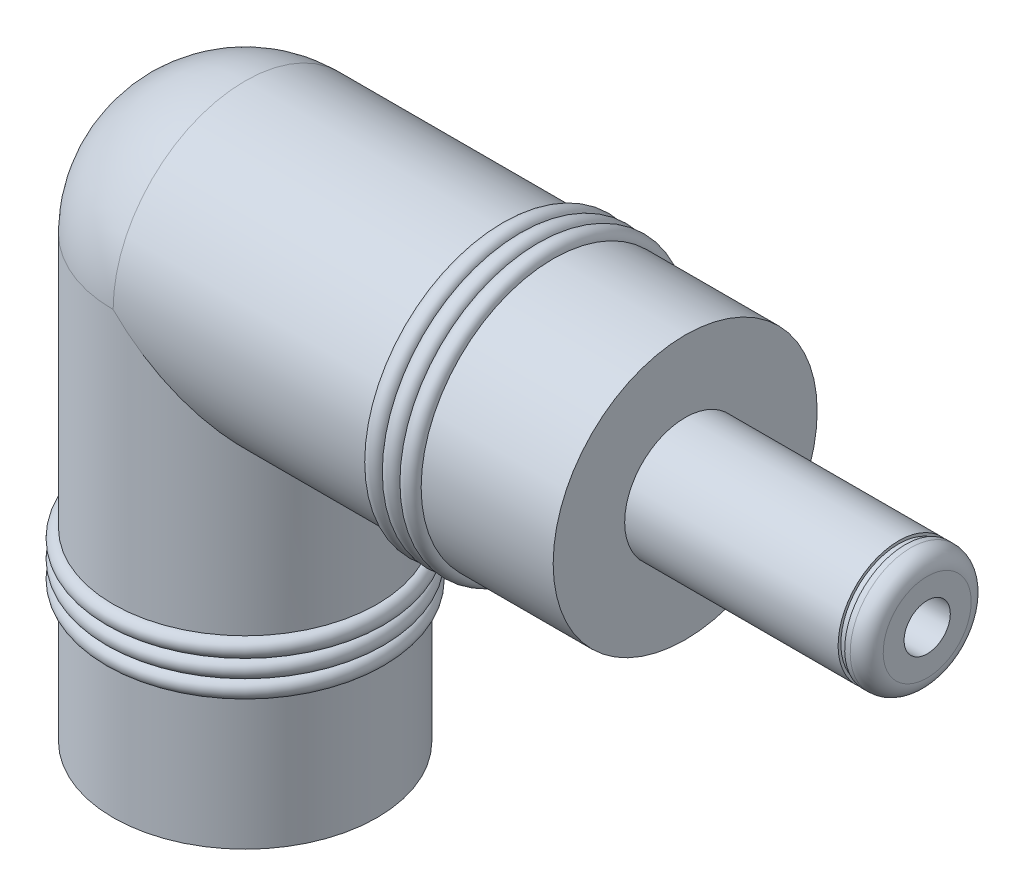
ISO-10303-21;
HEADER;
FILE_DESCRIPTION(('STEP AP214'),'2;1');
FILE_NAME('part.step','',(''),(''),'','','');
FILE_SCHEMA(('AUTOMOTIVE_DESIGN { 1 0 10303 214 1 1 1 1 }'));
ENDSEC;
DATA;
#1=APPLICATION_CONTEXT('core data for automotive mechanical design processes');
#2=APPLICATION_PROTOCOL_DEFINITION('international standard','automotive_design',2000,#1);
#3=PRODUCT_CONTEXT('',#1,'mechanical');
#4=PRODUCT('Part','Part','',(#3));
#5=PRODUCT_RELATED_PRODUCT_CATEGORY('part','',(#4));
#6=PRODUCT_DEFINITION_FORMATION('','',#4);
#7=PRODUCT_DEFINITION_CONTEXT('part definition',#1,'design');
#8=PRODUCT_DEFINITION('design','',#6,#7);
#9=PRODUCT_DEFINITION_SHAPE('','',#8);
#10=(LENGTH_UNIT() NAMED_UNIT(*) SI_UNIT(.MILLI.,.METRE.));
#11=(NAMED_UNIT(*) PLANE_ANGLE_UNIT() SI_UNIT($,.RADIAN.));
#12=(NAMED_UNIT(*) SI_UNIT($,.STERADIAN.) SOLID_ANGLE_UNIT());
#13=UNCERTAINTY_MEASURE_WITH_UNIT(LENGTH_MEASURE(1.E-05),#10,'distance_accuracy_value','');
#14=(GEOMETRIC_REPRESENTATION_CONTEXT(3) GLOBAL_UNCERTAINTY_ASSIGNED_CONTEXT((#13)) GLOBAL_UNIT_ASSIGNED_CONTEXT((#10,
#11,#12)) REPRESENTATION_CONTEXT('',''));
#15=CARTESIAN_POINT('',(0.,0.,0.));
#16=DIRECTION('',(0.,0.,1.));
#17=DIRECTION('',(1.,0.,0.));
#18=AXIS2_PLACEMENT_3D('',#15,#16,#17);
#19=CARTESIAN_POINT('',(0.,-20.,0.));
#20=DIRECTION('',(0.,-1.,0.));
#21=DIRECTION('',(-1.,0.,0.));
#22=AXIS2_PLACEMENT_3D('',#19,#20,#21);
#23=PLANE('',#22);
#24=CARTESIAN_POINT('',(0.,-20.,0.));
#25=DIRECTION('',(0.,-1.,0.));
#26=DIRECTION('',(1.,0.,0.));
#27=AXIS2_PLACEMENT_3D('',#24,#25,#26);
#28=CIRCLE('',#27,6.);
#29=CARTESIAN_POINT('',(6.,-20.,0.));
#30=VERTEX_POINT('',#29);
#31=EDGE_CURVE('E11',#30,#30,#28,.T.);
#32=ORIENTED_EDGE('',*,*,#31,.T.);
#33=EDGE_LOOP('',(#32));
#34=FACE_BOUND('',#33,.T.);
#35=CARTESIAN_POINT('',(0.,-20.,0.));
#36=DIRECTION('',(0.,1.,0.));
#37=DIRECTION('',(-1.,0.,0.));
#38=AXIS2_PLACEMENT_3D('',#35,#36,#37);
#39=CIRCLE('',#38,3.25);
#40=CARTESIAN_POINT('',(3.25,-20.,0.));
#41=VERTEX_POINT('',#40);
#42=EDGE_CURVE('E140',#41,#41,#39,.T.);
#43=ORIENTED_EDGE('',*,*,#42,.T.);
#44=EDGE_LOOP('',(#43));
#45=FACE_BOUND('',#44,.T.);
#46=ADVANCED_FACE('F17',(#34,#45),#23,.T.);
#47=CARTESIAN_POINT('',(0.,-10.,0.));
#48=DIRECTION('',(0.,-1.,0.));
#49=DIRECTION('',(1.,0.,0.));
#50=AXIS2_PLACEMENT_3D('',#47,#48,#49);
#51=CYLINDRICAL_SURFACE('',#50,6.);
#52=CARTESIAN_POINT('',(0.,-11.6,0.));
#53=DIRECTION('',(0.,1.,0.));
#54=DIRECTION('',(1.,0.,0.));
#55=AXIS2_PLACEMENT_3D('',#52,#53,#54);
#56=CIRCLE('',#55,6.);
#57=CARTESIAN_POINT('',(-6.,-11.6,0.));
#58=VERTEX_POINT('',#57);
#59=EDGE_CURVE('E27',#58,#58,#56,.T.);
#60=ORIENTED_EDGE('',*,*,#59,.T.);
#61=EDGE_LOOP('',(#60));
#62=FACE_BOUND('',#61,.T.);
#63=CARTESIAN_POINT('',(0.,0.,0.));
#64=DIRECTION('',(-0.707106781186548,-0.707106781186548,0.));
#65=DIRECTION('',(-0.707106781186548,0.707106781186548,0.));
#66=AXIS2_PLACEMENT_3D('',#63,#64,#65);
#67=ELLIPSE('',#66,8.48528137423857,6.);
#68=CARTESIAN_POINT('',(0.,0.,-6.));
#69=VERTEX_POINT('',#68);
#70=CARTESIAN_POINT('',(0.,0.,6.));
#71=VERTEX_POINT('',#70);
#72=EDGE_CURVE('E138',#69,#71,#67,.T.);
#73=ORIENTED_EDGE('',*,*,#72,.T.);
#74=CARTESIAN_POINT('',(0.,0.,0.));
#75=DIRECTION('',(0.,1.,0.));
#76=DIRECTION('',(1.,0.,0.));
#77=AXIS2_PLACEMENT_3D('',#74,#75,#76);
#78=CIRCLE('',#77,6.);
#79=EDGE_CURVE('E131',#69,#71,#78,.T.);
#80=ORIENTED_EDGE('',*,*,#79,.F.);
#81=EDGE_LOOP('',(#73,#80));
#82=FACE_BOUND('',#81,.T.);
#83=ADVANCED_FACE('F177',(#62,#82),#51,.T.);
#84=CARTESIAN_POINT('',(0.,-10.,0.));
#85=DIRECTION('',(0.,-1.,0.));
#86=DIRECTION('',(1.,0.,0.));
#87=AXIS2_PLACEMENT_3D('',#84,#85,#86);
#88=CYLINDRICAL_SURFACE('',#87,6.);
#89=ORIENTED_EDGE('',*,*,#31,.F.);
#90=EDGE_LOOP('',(#89));
#91=FACE_BOUND('',#90,.T.);
#92=CARTESIAN_POINT('',(0.,-14.,0.));
#93=DIRECTION('',(0.,-1.,0.));
#94=DIRECTION('',(1.,0.,0.));
#95=AXIS2_PLACEMENT_3D('',#92,#93,#94);
#96=CIRCLE('',#95,6.);
#97=CARTESIAN_POINT('',(-6.,-14.,0.));
#98=VERTEX_POINT('',#97);
#99=EDGE_CURVE('E150',#98,#98,#96,.T.);
#100=ORIENTED_EDGE('',*,*,#99,.T.);
#101=EDGE_LOOP('',(#100));
#102=FACE_BOUND('',#101,.T.);
#103=ADVANCED_FACE('F168',(#91,#102),#88,.T.);
#104=CARTESIAN_POINT('',(0.,-12.,0.));
#105=DIRECTION('',(0.,1.,0.));
#106=DIRECTION('',(1.,0.,0.));
#107=AXIS2_PLACEMENT_3D('',#104,#105,#106);
#108=TOROIDAL_SURFACE('',#107,6.,0.4);
#109=ORIENTED_EDGE('',*,*,#59,.F.);
#110=EDGE_LOOP('',(#109));
#111=FACE_BOUND('',#110,.T.);
#112=CARTESIAN_POINT('',(0.,-12.4,0.));
#113=DIRECTION('',(0.,-1.,0.));
#114=DIRECTION('',(1.,0.,0.));
#115=AXIS2_PLACEMENT_3D('',#112,#113,#114);
#116=CIRCLE('',#115,6.);
#117=CARTESIAN_POINT('',(-6.,-12.4,0.));
#118=VERTEX_POINT('',#117);
#119=EDGE_CURVE('E144',#118,#118,#116,.T.);
#120=ORIENTED_EDGE('',*,*,#119,.F.);
#121=EDGE_LOOP('',(#120));
#122=FACE_BOUND('',#121,.T.);
#123=ADVANCED_FACE('F166',(#111,#122),#108,.T.);
#124=CARTESIAN_POINT('',(0.,-12.8,0.));
#125=DIRECTION('',(0.,1.,0.));
#126=DIRECTION('',(1.,0.,0.));
#127=AXIS2_PLACEMENT_3D('',#124,#125,#126);
#128=TOROIDAL_SURFACE('',#127,6.,0.4);
#129=ORIENTED_EDGE('',*,*,#119,.T.);
#130=EDGE_LOOP('',(#129));
#131=FACE_BOUND('',#130,.T.);
#132=CARTESIAN_POINT('',(0.,-13.2,0.));
#133=DIRECTION('',(0.,-1.,0.));
#134=DIRECTION('',(1.,0.,0.));
#135=AXIS2_PLACEMENT_3D('',#132,#133,#134);
#136=CIRCLE('',#135,6.);
#137=CARTESIAN_POINT('',(-6.,-13.2,0.));
#138=VERTEX_POINT('',#137);
#139=EDGE_CURVE('E152',#138,#138,#136,.T.);
#140=ORIENTED_EDGE('',*,*,#139,.F.);
#141=EDGE_LOOP('',(#140));
#142=FACE_BOUND('',#141,.T.);
#143=ADVANCED_FACE('F19',(#131,#142),#128,.T.);
#144=CARTESIAN_POINT('',(0.,-13.6,0.));
#145=DIRECTION('',(0.,1.,0.));
#146=DIRECTION('',(1.,0.,0.));
#147=AXIS2_PLACEMENT_3D('',#144,#145,#146);
#148=TOROIDAL_SURFACE('',#147,6.,0.4);
#149=ORIENTED_EDGE('',*,*,#139,.T.);
#150=EDGE_LOOP('',(#149));
#151=FACE_BOUND('',#150,.T.);
#152=ORIENTED_EDGE('',*,*,#99,.F.);
#153=EDGE_LOOP('',(#152));
#154=FACE_BOUND('',#153,.T.);
#155=ADVANCED_FACE('F176',(#151,#154),#148,.T.);
#156=CARTESIAN_POINT('',(20.,0.,0.));
#157=DIRECTION('',(1.,0.,0.));
#158=DIRECTION('',(0.,0.,-1.));
#159=AXIS2_PLACEMENT_3D('',#156,#157,#158);
#160=PLANE('',#159);
#161=CARTESIAN_POINT('',(20.,0.,0.));
#162=DIRECTION('',(1.,0.,0.));
#163=DIRECTION('',(0.,0.,-1.));
#164=AXIS2_PLACEMENT_3D('',#161,#162,#163);
#165=CIRCLE('',#164,1.05);
#166=CARTESIAN_POINT('',(20.,0.,-1.05));
#167=VERTEX_POINT('',#166);
#168=EDGE_CURVE('E135',#167,#167,#165,.T.);
#169=ORIENTED_EDGE('',*,*,#168,.T.);
#170=EDGE_LOOP('',(#169));
#171=FACE_BOUND('',#170,.T.);
#172=ADVANCED_FACE('F196',(#171),#160,.T.);
#173=CARTESIAN_POINT('',(10.,0.,0.));
#174=DIRECTION('',(-1.,0.,0.));
#175=DIRECTION('',(0.,0.,-1.));
#176=AXIS2_PLACEMENT_3D('',#173,#174,#175);
#177=CYLINDRICAL_SURFACE('',#176,6.);
#178=CARTESIAN_POINT('',(20.,0.,0.));
#179=DIRECTION('',(1.,0.,0.));
#180=DIRECTION('',(0.,0.,-1.));
#181=AXIS2_PLACEMENT_3D('',#178,#179,#180);
#182=CIRCLE('',#181,6.);
#183=CARTESIAN_POINT('',(20.,0.,-6.));
#184=VERTEX_POINT('',#183);
#185=EDGE_CURVE('E109',#184,#184,#182,.T.);
#186=ORIENTED_EDGE('',*,*,#185,.F.);
#187=EDGE_LOOP('',(#186));
#188=FACE_BOUND('',#187,.T.);
#189=CARTESIAN_POINT('',(14.,0.,0.));
#190=DIRECTION('',(1.,0.,0.));
#191=DIRECTION('',(0.,0.,-1.));
#192=AXIS2_PLACEMENT_3D('',#189,#190,#191);
#193=CIRCLE('',#192,6.);
#194=CARTESIAN_POINT('',(14.,0.,6.));
#195=VERTEX_POINT('',#194);
#196=EDGE_CURVE('E124',#195,#195,#193,.T.);
#197=ORIENTED_EDGE('',*,*,#196,.T.);
#198=EDGE_LOOP('',(#197));
#199=FACE_BOUND('',#198,.T.);
#200=ADVANCED_FACE('F210',(#188,#199),#177,.T.);
#201=CARTESIAN_POINT('',(12.,0.,0.));
#202=DIRECTION('',(1.,0.,0.));
#203=DIRECTION('',(0.,0.,-1.));
#204=AXIS2_PLACEMENT_3D('',#201,#202,#203);
#205=TOROIDAL_SURFACE('',#204,6.,0.4);
#206=CARTESIAN_POINT('',(12.4,0.,0.));
#207=DIRECTION('',(1.,0.,0.));
#208=DIRECTION('',(0.,0.,-1.));
#209=AXIS2_PLACEMENT_3D('',#206,#207,#208);
#210=CIRCLE('',#209,6.);
#211=CARTESIAN_POINT('',(12.4,0.,6.));
#212=VERTEX_POINT('',#211);
#213=EDGE_CURVE('E153',#212,#212,#210,.T.);
#214=ORIENTED_EDGE('',*,*,#213,.F.);
#215=EDGE_LOOP('',(#214));
#216=FACE_BOUND('',#215,.T.);
#217=CARTESIAN_POINT('',(11.6,0.,0.));
#218=DIRECTION('',(-1.,0.,0.));
#219=DIRECTION('',(0.,0.,-1.));
#220=AXIS2_PLACEMENT_3D('',#217,#218,#219);
#221=CIRCLE('',#220,6.);
#222=CARTESIAN_POINT('',(11.6,0.,6.));
#223=VERTEX_POINT('',#222);
#224=EDGE_CURVE('E125',#223,#223,#221,.T.);
#225=ORIENTED_EDGE('',*,*,#224,.F.);
#226=EDGE_LOOP('',(#225));
#227=FACE_BOUND('',#226,.T.);
#228=ADVANCED_FACE('F212',(#216,#227),#205,.T.);
#229=CARTESIAN_POINT('',(12.8,0.,0.));
#230=DIRECTION('',(1.,0.,0.));
#231=DIRECTION('',(0.,0.,-1.));
#232=AXIS2_PLACEMENT_3D('',#229,#230,#231);
#233=TOROIDAL_SURFACE('',#232,6.,0.4);
#234=CARTESIAN_POINT('',(13.2,0.,0.));
#235=DIRECTION('',(1.,0.,0.));
#236=DIRECTION('',(0.,0.,-1.));
#237=AXIS2_PLACEMENT_3D('',#234,#235,#236);
#238=CIRCLE('',#237,6.);
#239=CARTESIAN_POINT('',(13.2,0.,6.));
#240=VERTEX_POINT('',#239);
#241=EDGE_CURVE('E122',#240,#240,#238,.T.);
#242=ORIENTED_EDGE('',*,*,#241,.F.);
#243=EDGE_LOOP('',(#242));
#244=FACE_BOUND('',#243,.T.);
#245=ORIENTED_EDGE('',*,*,#213,.T.);
#246=EDGE_LOOP('',(#245));
#247=FACE_BOUND('',#246,.T.);
#248=ADVANCED_FACE('F225',(#244,#247),#233,.T.);
#249=CARTESIAN_POINT('',(13.6,0.,0.));
#250=DIRECTION('',(1.,0.,0.));
#251=DIRECTION('',(0.,0.,-1.));
#252=AXIS2_PLACEMENT_3D('',#249,#250,#251);
#253=TOROIDAL_SURFACE('',#252,6.,0.4);
#254=ORIENTED_EDGE('',*,*,#196,.F.);
#255=EDGE_LOOP('',(#254));
#256=FACE_BOUND('',#255,.T.);
#257=ORIENTED_EDGE('',*,*,#241,.T.);
#258=EDGE_LOOP('',(#257));
#259=FACE_BOUND('',#258,.T.);
#260=ADVANCED_FACE('F193',(#256,#259),#253,.T.);
#261=CARTESIAN_POINT('',(10.,0.,0.));
#262=DIRECTION('',(-1.,0.,0.));
#263=DIRECTION('',(0.,0.,-1.));
#264=AXIS2_PLACEMENT_3D('',#261,#262,#263);
#265=CYLINDRICAL_SURFACE('',#264,6.);
#266=ORIENTED_EDGE('',*,*,#224,.T.);
#267=EDGE_LOOP('',(#266));
#268=FACE_BOUND('',#267,.T.);
#269=ORIENTED_EDGE('',*,*,#72,.F.);
#270=CARTESIAN_POINT('',(0.,0.,0.));
#271=DIRECTION('',(-1.,0.,0.));
#272=DIRECTION('',(0.,0.,-1.));
#273=AXIS2_PLACEMENT_3D('',#270,#271,#272);
#274=CIRCLE('',#273,6.);
#275=EDGE_CURVE('E128',#71,#69,#274,.T.);
#276=ORIENTED_EDGE('',*,*,#275,.F.);
#277=EDGE_LOOP('',(#269,#276));
#278=FACE_BOUND('',#277,.T.);
#279=ADVANCED_FACE('F240',(#268,#278),#265,.T.);
#280=CARTESIAN_POINT('',(0.,0.,0.));
#281=DIRECTION('',(0.,0.,1.));
#282=DIRECTION('',(1.,0.,0.));
#283=AXIS2_PLACEMENT_3D('',#280,#281,#282);
#284=SPHERICAL_SURFACE('',#283,6.);
#285=ORIENTED_EDGE('',*,*,#275,.T.);
#286=ORIENTED_EDGE('',*,*,#79,.T.);
#287=EDGE_LOOP('',(#285,#286));
#288=FACE_BOUND('',#287,.T.);
#289=ADVANCED_FACE('F237',(#288),#284,.T.);
#290=CARTESIAN_POINT('',(0.,-9.,0.));
#291=DIRECTION('',(0.,1.,0.));
#292=DIRECTION('',(-1.,0.,0.));
#293=AXIS2_PLACEMENT_3D('',#290,#291,#292);
#294=PLANE('',#293);
#295=CARTESIAN_POINT('',(0.,-9.,0.));
#296=DIRECTION('',(0.,1.,0.));
#297=DIRECTION('',(1.,0.,0.));
#298=AXIS2_PLACEMENT_3D('',#295,#296,#297);
#299=CIRCLE('',#298,2.75);
#300=CARTESIAN_POINT('',(2.75,-9.,0.));
#301=VERTEX_POINT('',#300);
#302=EDGE_CURVE('E132',#301,#301,#299,.T.);
#303=ORIENTED_EDGE('',*,*,#302,.F.);
#304=EDGE_LOOP('',(#303));
#305=FACE_BOUND('',#304,.T.);
#306=CARTESIAN_POINT('',(0.,-9.,0.));
#307=DIRECTION('',(0.,1.,0.));
#308=DIRECTION('',(1.,0.,0.));
#309=AXIS2_PLACEMENT_3D('',#306,#307,#308);
#310=CIRCLE('',#309,1.05);
#311=CARTESIAN_POINT('',(1.05,-9.,0.));
#312=VERTEX_POINT('',#311);
#313=EDGE_CURVE('E108',#312,#312,#310,.T.);
#314=ORIENTED_EDGE('',*,*,#313,.T.);
#315=EDGE_LOOP('',(#314));
#316=FACE_BOUND('',#315,.T.);
#317=ADVANCED_FACE('F208',(#305,#316),#294,.F.);
#318=CARTESIAN_POINT('',(0.,-15.,0.));
#319=DIRECTION('',(0.,1.,0.));
#320=DIRECTION('',(1.,0.,0.));
#321=AXIS2_PLACEMENT_3D('',#318,#319,#320);
#322=CYLINDRICAL_SURFACE('',#321,2.75);
#323=ORIENTED_EDGE('',*,*,#302,.T.);
#324=EDGE_LOOP('',(#323));
#325=FACE_BOUND('',#324,.T.);
#326=CARTESIAN_POINT('',(0.,-20.,0.));
#327=DIRECTION('',(0.,1.,0.));
#328=DIRECTION('',(1.,0.,0.));
#329=AXIS2_PLACEMENT_3D('',#326,#327,#328);
#330=CIRCLE('',#329,2.75);
#331=CARTESIAN_POINT('',(-2.75,-20.,0.));
#332=VERTEX_POINT('',#331);
#333=EDGE_CURVE('E111',#332,#332,#330,.T.);
#334=ORIENTED_EDGE('',*,*,#333,.F.);
#335=EDGE_LOOP('',(#334));
#336=FACE_BOUND('',#335,.T.);
#337=ADVANCED_FACE('F204',(#325,#336),#322,.F.);
#338=CARTESIAN_POINT('',(0.,-20.,0.));
#339=DIRECTION('',(0.,1.,0.));
#340=DIRECTION('',(1.,0.,0.));
#341=AXIS2_PLACEMENT_3D('',#338,#339,#340);
#342=TOROIDAL_SURFACE('',#341,3.,0.25);
#343=ORIENTED_EDGE('',*,*,#42,.F.);
#344=EDGE_LOOP('',(#343));
#345=FACE_BOUND('',#344,.T.);
#346=ORIENTED_EDGE('',*,*,#333,.T.);
#347=EDGE_LOOP('',(#346));
#348=FACE_BOUND('',#347,.T.);
#349=ADVANCED_FACE('F207',(#345,#348),#342,.T.);
#350=CARTESIAN_POINT('',(0.,-13.975,0.));
#351=DIRECTION('',(0.,1.,0.));
#352=DIRECTION('',(1.,0.,0.));
#353=AXIS2_PLACEMENT_3D('',#350,#351,#352);
#354=CYLINDRICAL_SURFACE('',#353,1.05);
#355=CARTESIAN_POINT('',(0.,-18.95,0.));
#356=DIRECTION('',(0.,-1.,0.));
#357=DIRECTION('',(1.,0.,0.));
#358=AXIS2_PLACEMENT_3D('',#355,#356,#357);
#359=CIRCLE('',#358,1.05);
#360=CARTESIAN_POINT('',(1.05,-18.95,0.));
#361=VERTEX_POINT('',#360);
#362=EDGE_CURVE('E105',#361,#361,#359,.T.);
#363=ORIENTED_EDGE('',*,*,#362,.F.);
#364=EDGE_LOOP('',(#363));
#365=FACE_BOUND('',#364,.T.);
#366=ORIENTED_EDGE('',*,*,#313,.F.);
#367=EDGE_LOOP('',(#366));
#368=FACE_BOUND('',#367,.T.);
#369=ADVANCED_FACE('F220',(#365,#368),#354,.T.);
#370=CARTESIAN_POINT('',(0.,-18.95,0.));
#371=DIRECTION('',(0.,0.,1.));
#372=DIRECTION('',(1.,0.,0.));
#373=AXIS2_PLACEMENT_3D('',#370,#371,#372);
#374=SPHERICAL_SURFACE('',#373,1.05);
#375=CARTESIAN_POINT('',(0.,-18.95,0.));
#376=DIRECTION('',(0.,-1.,0.));
#377=DIRECTION('',(1.,0.,0.));
#378=AXIS2_PLACEMENT_3D('',#375,#376,#377);
#379=SPHERICAL_SURFACE('',#378,1.05);
#380=ORIENTED_EDGE('',*,*,#362,.T.);
#381=EDGE_LOOP('',(#380));
#382=FACE_BOUND('',#381,.T.);
#383=ADVANCED_FACE('F106',(#382),#379,.T.);
#384=CARTESIAN_POINT('',(20.,0.,0.));
#385=DIRECTION('',(1.,0.,0.));
#386=DIRECTION('',(0.,0.,-1.));
#387=AXIS2_PLACEMENT_3D('',#384,#385,#386);
#388=PLANE('',#387);
#389=ORIENTED_EDGE('',*,*,#185,.T.);
#390=EDGE_LOOP('',(#389));
#391=FACE_BOUND('',#390,.T.);
#392=CARTESIAN_POINT('',(20.,0.,0.));
#393=DIRECTION('',(-1.,0.,0.));
#394=DIRECTION('',(0.,1.,0.));
#395=AXIS2_PLACEMENT_3D('',#392,#393,#394);
#396=CIRCLE('',#395,2.75);
#397=CARTESIAN_POINT('',(20.,-2.75,0.));
#398=VERTEX_POINT('',#397);
#399=EDGE_CURVE('E121',#398,#398,#396,.T.);
#400=ORIENTED_EDGE('',*,*,#399,.T.);
#401=EDGE_LOOP('',(#400));
#402=FACE_BOUND('',#401,.T.);
#403=ADVANCED_FACE('F255',(#391,#402),#388,.T.);
#404=CARTESIAN_POINT('',(29.875,0.,0.));
#405=DIRECTION('',(-1.,0.,0.));
#406=DIRECTION('',(0.,1.,0.));
#407=AXIS2_PLACEMENT_3D('',#404,#405,#406);
#408=CYLINDRICAL_SURFACE('',#407,2.625);
#409=CARTESIAN_POINT('',(29.7,0.,0.));
#410=DIRECTION('',(1.,0.,0.));
#411=DIRECTION('',(0.,1.,0.));
#412=AXIS2_PLACEMENT_3D('',#409,#410,#411);
#413=CIRCLE('',#412,2.625);
#414=CARTESIAN_POINT('',(29.7,2.625,0.));
#415=VERTEX_POINT('',#414);
#416=EDGE_CURVE('E113',#415,#415,#413,.T.);
#417=ORIENTED_EDGE('',*,*,#416,.T.);
#418=EDGE_LOOP('',(#417));
#419=FACE_BOUND('',#418,.T.);
#420=CARTESIAN_POINT('',(30.,0.,0.));
#421=DIRECTION('',(-1.,0.,0.));
#422=DIRECTION('',(0.,1.,0.));
#423=AXIS2_PLACEMENT_3D('',#420,#421,#422);
#424=CIRCLE('',#423,2.625);
#425=CARTESIAN_POINT('',(30.,-2.625,0.));
#426=VERTEX_POINT('',#425);
#427=EDGE_CURVE('E21',#426,#426,#424,.T.);
#428=ORIENTED_EDGE('',*,*,#427,.T.);
#429=EDGE_LOOP('',(#428));
#430=FACE_BOUND('',#429,.T.);
#431=ADVANCED_FACE('F251',(#419,#430),#408,.T.);
#432=CARTESIAN_POINT('',(29.7,2.6875,0.));
#433=DIRECTION('',(1.,0.,0.));
#434=DIRECTION('',(0.,1.,0.));
#435=AXIS2_PLACEMENT_3D('',#432,#433,#434);
#436=PLANE('',#435);
#437=CARTESIAN_POINT('',(29.7,0.,0.));
#438=DIRECTION('',(1.,0.,0.));
#439=DIRECTION('',(0.,1.,0.));
#440=AXIS2_PLACEMENT_3D('',#437,#438,#439);
#441=CIRCLE('',#440,2.75);
#442=CARTESIAN_POINT('',(29.7,2.75,0.));
#443=VERTEX_POINT('',#442);
#444=EDGE_CURVE('E119',#443,#443,#441,.T.);
#445=ORIENTED_EDGE('',*,*,#444,.T.);
#446=EDGE_LOOP('',(#445));
#447=FACE_BOUND('',#446,.T.);
#448=ORIENTED_EDGE('',*,*,#416,.F.);
#449=EDGE_LOOP('',(#448));
#450=FACE_BOUND('',#449,.T.);
#451=ADVANCED_FACE('F254',(#447,#450),#436,.T.);
#452=CARTESIAN_POINT('',(31.,1.,0.));
#453=DIRECTION('',(1.,0.,0.));
#454=DIRECTION('',(0.,1.,0.));
#455=AXIS2_PLACEMENT_3D('',#452,#453,#454);
#456=PLANE('',#455);
#457=CARTESIAN_POINT('',(31.,0.,0.));
#458=DIRECTION('',(1.,0.,0.));
#459=DIRECTION('',(0.,1.,0.));
#460=AXIS2_PLACEMENT_3D('',#457,#458,#459);
#461=CIRCLE('',#460,2.);
#462=CARTESIAN_POINT('',(31.,2.,0.));
#463=VERTEX_POINT('',#462);
#464=EDGE_CURVE('E118',#463,#463,#461,.T.);
#465=ORIENTED_EDGE('',*,*,#464,.T.);
#466=EDGE_LOOP('',(#465));
#467=FACE_BOUND('',#466,.T.);
#468=CARTESIAN_POINT('',(31.,0.,0.));
#469=DIRECTION('',(-1.,0.,0.));
#470=DIRECTION('',(0.,0.,-1.));
#471=AXIS2_PLACEMENT_3D('',#468,#469,#470);
#472=CIRCLE('',#471,1.05);
#473=CARTESIAN_POINT('',(31.,0.,1.05));
#474=VERTEX_POINT('',#473);
#475=EDGE_CURVE('E147',#474,#474,#472,.T.);
#476=ORIENTED_EDGE('',*,*,#475,.T.);
#477=EDGE_LOOP('',(#476));
#478=FACE_BOUND('',#477,.T.);
#479=ADVANCED_FACE('F235',(#467,#478),#456,.T.);
#480=CARTESIAN_POINT('',(30.25,0.,0.));
#481=DIRECTION('',(1.,0.,0.));
#482=DIRECTION('',(0.,0.,-1.));
#483=AXIS2_PLACEMENT_3D('',#480,#481,#482);
#484=TOROIDAL_SURFACE('',#483,2.,0.75);
#485=CARTESIAN_POINT('',(30.25,0.,0.));
#486=DIRECTION('',(1.,0.,0.));
#487=DIRECTION('',(0.,1.,0.));
#488=AXIS2_PLACEMENT_3D('',#485,#486,#487);
#489=CIRCLE('',#488,2.75);
#490=CARTESIAN_POINT('',(30.25,2.75,0.));
#491=VERTEX_POINT('',#490);
#492=EDGE_CURVE('E127',#491,#491,#489,.T.);
#493=ORIENTED_EDGE('',*,*,#492,.T.);
#494=EDGE_LOOP('',(#493));
#495=FACE_BOUND('',#494,.T.);
#496=ORIENTED_EDGE('',*,*,#464,.F.);
#497=EDGE_LOOP('',(#496));
#498=FACE_BOUND('',#497,.T.);
#499=ADVANCED_FACE('F218',(#495,#498),#484,.T.);
#500=CARTESIAN_POINT('',(30.125,0.,0.));
#501=DIRECTION('',(-1.,0.,0.));
#502=DIRECTION('',(0.,1.,0.));
#503=AXIS2_PLACEMENT_3D('',#500,#501,#502);
#504=CYLINDRICAL_SURFACE('',#503,2.75);
#505=CARTESIAN_POINT('',(30.,0.,0.));
#506=DIRECTION('',(1.,0.,0.));
#507=DIRECTION('',(0.,1.,0.));
#508=AXIS2_PLACEMENT_3D('',#505,#506,#507);
#509=CIRCLE('',#508,2.75);
#510=CARTESIAN_POINT('',(30.,2.75,0.));
#511=VERTEX_POINT('',#510);
#512=EDGE_CURVE('E133',#511,#511,#509,.T.);
#513=ORIENTED_EDGE('',*,*,#512,.T.);
#514=EDGE_LOOP('',(#513));
#515=FACE_BOUND('',#514,.T.);
#516=ORIENTED_EDGE('',*,*,#492,.F.);
#517=EDGE_LOOP('',(#516));
#518=FACE_BOUND('',#517,.T.);
#519=ADVANCED_FACE('F215',(#515,#518),#504,.T.);
#520=CARTESIAN_POINT('',(30.,1.375,0.));
#521=DIRECTION('',(-1.,0.,0.));
#522=DIRECTION('',(0.,-1.,0.));
#523=AXIS2_PLACEMENT_3D('',#520,#521,#522);
#524=PLANE('',#523);
#525=ORIENTED_EDGE('',*,*,#427,.F.);
#526=EDGE_LOOP('',(#525));
#527=FACE_BOUND('',#526,.T.);
#528=ORIENTED_EDGE('',*,*,#512,.F.);
#529=EDGE_LOOP('',(#528));
#530=FACE_BOUND('',#529,.T.);
#531=ADVANCED_FACE('F202',(#527,#530),#524,.T.);
#532=CARTESIAN_POINT('',(26.,0.,0.));
#533=DIRECTION('',(-1.,0.,0.));
#534=DIRECTION('',(0.,0.,-1.));
#535=AXIS2_PLACEMENT_3D('',#532,#533,#534);
#536=CYLINDRICAL_SURFACE('',#535,1.05);
#537=ORIENTED_EDGE('',*,*,#168,.F.);
#538=EDGE_LOOP('',(#537));
#539=FACE_BOUND('',#538,.T.);
#540=ORIENTED_EDGE('',*,*,#475,.F.);
#541=EDGE_LOOP('',(#540));
#542=FACE_BOUND('',#541,.T.);
#543=ADVANCED_FACE('F198',(#539,#542),#536,.F.);
#544=CARTESIAN_POINT('',(24.825,0.,0.));
#545=DIRECTION('',(-1.,0.,0.));
#546=DIRECTION('',(0.,1.,0.));
#547=AXIS2_PLACEMENT_3D('',#544,#545,#546);
#548=CYLINDRICAL_SURFACE('',#547,2.75);
#549=ORIENTED_EDGE('',*,*,#399,.F.);
#550=EDGE_LOOP('',(#549));
#551=FACE_BOUND('',#550,.T.);
#552=ORIENTED_EDGE('',*,*,#444,.F.);
#553=EDGE_LOOP('',(#552));
#554=FACE_BOUND('',#553,.T.);
#555=ADVANCED_FACE('F201',(#551,#554),#548,.T.);
#556=CLOSED_SHELL('',(#46,#83,#103,#123,#143,#155,#172,#200,#228,#248,#260,#279,#289,#317,#337,
#349,#369,#383,#403,#431,#451,#479,#499,#519,#531,#543,#555));
#557=MANIFOLD_SOLID_BREP('B1',#556);
#558=ADVANCED_BREP_SHAPE_REPRESENTATION('',(#18,#557),#14);
#559=SHAPE_DEFINITION_REPRESENTATION(#9,#558);
ENDSEC;
END-ISO-10303-21;
